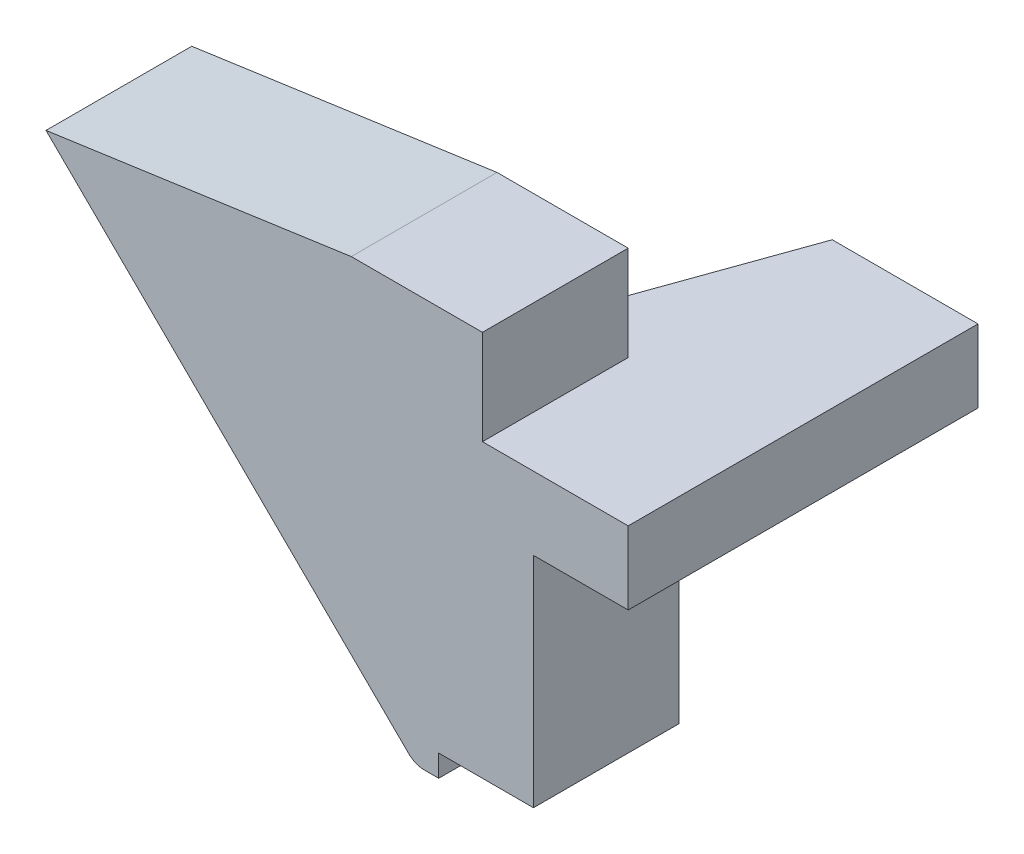
ISO-10303-21;
HEADER;
FILE_DESCRIPTION(('STEP AP214'),'2;1');
FILE_NAME('part.step','',(''),(''),'','','');
FILE_SCHEMA(('AUTOMOTIVE_DESIGN { 1 0 10303 214 1 1 1 1 }'));
ENDSEC;
DATA;
#1=APPLICATION_CONTEXT('core data for automotive mechanical design processes');
#2=APPLICATION_PROTOCOL_DEFINITION('international standard','automotive_design',2000,#1);
#3=PRODUCT_CONTEXT('',#1,'mechanical');
#4=PRODUCT('Part','Part','',(#3));
#5=PRODUCT_RELATED_PRODUCT_CATEGORY('part','',(#4));
#6=PRODUCT_DEFINITION_FORMATION('','',#4);
#7=PRODUCT_DEFINITION_CONTEXT('part definition',#1,'design');
#8=PRODUCT_DEFINITION('design','',#6,#7);
#9=PRODUCT_DEFINITION_SHAPE('','',#8);
#10=(LENGTH_UNIT() NAMED_UNIT(*) SI_UNIT(.MILLI.,.METRE.));
#11=(NAMED_UNIT(*) PLANE_ANGLE_UNIT() SI_UNIT($,.RADIAN.));
#12=(NAMED_UNIT(*) SI_UNIT($,.STERADIAN.) SOLID_ANGLE_UNIT());
#13=UNCERTAINTY_MEASURE_WITH_UNIT(LENGTH_MEASURE(1.E-05),#10,'distance_accuracy_value','');
#14=(GEOMETRIC_REPRESENTATION_CONTEXT(3) GLOBAL_UNCERTAINTY_ASSIGNED_CONTEXT((#13)) GLOBAL_UNIT_ASSIGNED_CONTEXT((#10,
#11,#12)) REPRESENTATION_CONTEXT('',''));
#15=CARTESIAN_POINT('',(0.,0.,0.));
#16=DIRECTION('',(0.,0.,1.));
#17=DIRECTION('',(1.,0.,0.));
#18=AXIS2_PLACEMENT_3D('',#15,#16,#17);
#19=CARTESIAN_POINT('',(-13.,0.,164.159554326699));
#20=DIRECTION('',(0.,0.,1.));
#21=DIRECTION('',(-1.,0.,0.));
#22=AXIS2_PLACEMENT_3D('',#19,#20,#21);
#23=PLANE('',#22);
#24=DIRECTION('',(1.,0.,0.));
#25=VECTOR('',#24,1.);
#26=CARTESIAN_POINT('',(-7.99999999999999,22.,164.159554326699));
#27=LINE('',#26,#25);
#28=CARTESIAN_POINT('',(-7.99999999999999,22.,164.159554326699));
#29=VERTEX_POINT('',#28);
#30=CARTESIAN_POINT('',(2.,22.,164.159554326699));
#31=VERTEX_POINT('',#30);
#32=EDGE_CURVE('E226',#29,#31,#27,.T.);
#33=ORIENTED_EDGE('',*,*,#32,.T.);
#34=DIRECTION('',(0.,-1.,0.));
#35=VECTOR('',#34,1.);
#36=CARTESIAN_POINT('',(2.,30.,164.159554326699));
#37=LINE('',#36,#35);
#38=CARTESIAN_POINT('',(2.,0.,164.159554326699));
#39=VERTEX_POINT('',#38);
#40=EDGE_CURVE('E281',#31,#39,#37,.T.);
#41=ORIENTED_EDGE('',*,*,#40,.T.);
#42=DIRECTION('',(-1.,0.,0.));
#43=VECTOR('',#42,1.);
#44=CARTESIAN_POINT('',(2.,0.,164.159554326699));
#45=LINE('',#44,#43);
#46=CARTESIAN_POINT('',(-11.,0.,164.159554326699));
#47=VERTEX_POINT('',#46);
#48=EDGE_CURVE('E284',#39,#47,#45,.T.);
#49=ORIENTED_EDGE('',*,*,#48,.T.);
#50=DIRECTION('',(0.,-1.,0.));
#51=VECTOR('',#50,1.);
#52=CARTESIAN_POINT('',(-11.,0.,164.159554326699));
#53=LINE('',#52,#51);
#54=CARTESIAN_POINT('',(-11.,-3.,164.159554326699));
#55=VERTEX_POINT('',#54);
#56=EDGE_CURVE('E287',#47,#55,#53,.T.);
#57=ORIENTED_EDGE('',*,*,#56,.T.);
#58=DIRECTION('',(-1.,0.,0.));
#59=VECTOR('',#58,1.);
#60=CARTESIAN_POINT('',(-11.,-3.,164.159554326699));
#61=LINE('',#60,#59);
#62=CARTESIAN_POINT('',(-13.,-3.,164.159554326699));
#63=VERTEX_POINT('',#62);
#64=EDGE_CURVE('E290',#55,#63,#61,.T.);
#65=ORIENTED_EDGE('',*,*,#64,.T.);
#66=CARTESIAN_POINT('',(-13.,0.,164.159554326699));
#67=DIRECTION('',(0.,0.,-1.));
#68=DIRECTION('',(-1.,0.,0.));
#69=AXIS2_PLACEMENT_3D('',#66,#67,#68);
#70=CIRCLE('',#69,3.);
#71=CARTESIAN_POINT('',(-15.1213203435597,-2.12132034355963,164.159554326699));
#72=VERTEX_POINT('',#71);
#73=EDGE_CURVE('E293',#63,#72,#70,.T.);
#74=ORIENTED_EDGE('',*,*,#73,.T.);
#75=DIRECTION('',(-0.711348006313715,0.702839963230252,0.));
#76=VECTOR('',#75,1.);
#77=CARTESIAN_POINT('',(-15.1213203435597,-2.12132034355963,164.159554326699));
#78=LINE('',#77,#76);
#79=CARTESIAN_POINT('',(-64.8885781508878,47.0506986076638,164.159554326699));
#80=VERTEX_POINT('',#79);
#81=EDGE_CURVE('E296',#72,#80,#78,.T.);
#82=ORIENTED_EDGE('',*,*,#81,.T.);
#83=DIRECTION('',(0.99006425657859,0.140615674252494,0.));
#84=VECTOR('',#83,1.);
#85=CARTESIAN_POINT('',(-64.8885781508878,47.0506986076638,164.159554326699));
#86=LINE('',#85,#84);
#87=CARTESIAN_POINT('',(-23.0000000000006,53.,164.159554326699));
#88=VERTEX_POINT('',#87);
#89=EDGE_CURVE('E299',#80,#88,#86,.T.);
#90=ORIENTED_EDGE('',*,*,#89,.T.);
#91=DIRECTION('',(1.,0.,0.));
#92=VECTOR('',#91,1.);
#93=CARTESIAN_POINT('',(-23.0000000000006,53.,164.159554326699));
#94=LINE('',#93,#92);
#95=CARTESIAN_POINT('',(-5.,53.,164.159554326699));
#96=VERTEX_POINT('',#95);
#97=EDGE_CURVE('E302',#88,#96,#94,.T.);
#98=ORIENTED_EDGE('',*,*,#97,.T.);
#99=DIRECTION('',(0.,-1.,0.));
#100=VECTOR('',#99,1.);
#101=CARTESIAN_POINT('',(-5.,53.,164.159554326699));
#102=LINE('',#101,#100);
#103=CARTESIAN_POINT('',(-5.,40.,164.159554326699));
#104=VERTEX_POINT('',#103);
#105=EDGE_CURVE('E217',#96,#104,#102,.T.);
#106=ORIENTED_EDGE('',*,*,#105,.T.);
#107=DIRECTION('',(-1.,0.,0.));
#108=VECTOR('',#107,1.);
#109=CARTESIAN_POINT('',(15.,40.,164.159554326699));
#110=LINE('',#109,#108);
#111=CARTESIAN_POINT('',(-15.,40.,164.159554326699));
#112=VERTEX_POINT('',#111);
#113=EDGE_CURVE('E198',#104,#112,#110,.T.);
#114=ORIENTED_EDGE('',*,*,#113,.T.);
#115=DIRECTION('',(0.,-1.,0.));
#116=VECTOR('',#115,1.);
#117=CARTESIAN_POINT('',(-15.,40.,164.159554326699));
#118=LINE('',#117,#116);
#119=CARTESIAN_POINT('',(-15.,43.,164.159554326699));
#120=VERTEX_POINT('',#119);
#121=EDGE_CURVE('E204',#120,#112,#118,.T.);
#122=ORIENTED_EDGE('',*,*,#121,.F.);
#123=DIRECTION('',(1.,0.,0.));
#124=VECTOR('',#123,1.);
#125=CARTESIAN_POINT('',(-5.,43.,164.159554326699));
#126=LINE('',#125,#124);
#127=CARTESIAN_POINT('',(-22.2934113871567,43.,164.159554326699));
#128=VERTEX_POINT('',#127);
#129=EDGE_CURVE('E261',#128,#120,#126,.T.);
#130=ORIENTED_EDGE('',*,*,#129,.F.);
#131=DIRECTION('',(0.99006425657859,0.140615674252493,0.));
#132=VECTOR('',#131,1.);
#133=CARTESIAN_POINT('',(-21.5938432574751,43.0993574342141,164.159554326699));
#134=LINE('',#133,#132);
#135=CARTESIAN_POINT('',(-43.5109209246919,39.9865446714646,164.159554326699));
#136=VERTEX_POINT('',#135);
#137=EDGE_CURVE('E264',#136,#128,#134,.T.);
#138=ORIENTED_EDGE('',*,*,#137,.F.);
#139=DIRECTION('',(-0.711348006313715,0.702839963230252,0.));
#140=VECTOR('',#139,1.);
#141=CARTESIAN_POINT('',(-8.09292071125713,4.99215971957752,164.159554326699));
#142=LINE('',#141,#140);
#143=CARTESIAN_POINT('',(-13.1613820762649,10.,164.159554326699));
#144=VERTEX_POINT('',#143);
#145=EDGE_CURVE('E267',#144,#136,#142,.T.);
#146=ORIENTED_EDGE('',*,*,#145,.F.);
#147=DIRECTION('',(-1.,0.,0.));
#148=VECTOR('',#147,1.);
#149=CARTESIAN_POINT('',(0.,10.,164.159554326699));
#150=LINE('',#149,#148);
#151=CARTESIAN_POINT('',(-8.,10.,164.159554326699));
#152=VERTEX_POINT('',#151);
#153=EDGE_CURVE('E270',#152,#144,#150,.T.);
#154=ORIENTED_EDGE('',*,*,#153,.F.);
#155=DIRECTION('',(0.,-1.,0.));
#156=VECTOR('',#155,1.);
#157=CARTESIAN_POINT('',(-8.,0.,164.159554326699));
#158=LINE('',#157,#156);
#159=EDGE_CURVE('E211',#29,#152,#158,.T.);
#160=ORIENTED_EDGE('',*,*,#159,.F.);
#161=EDGE_LOOP('',(#33,#41,#49,#57,#65,#74,#82,#90,#98,#106,#114,#122,#130,#138,#146,#154,#160));
#162=FACE_BOUND('',#161,.T.);
#163=ADVANCED_FACE('F33',(#162),#23,.F.);
#164=CARTESIAN_POINT('',(15.,0.,252.319108653397));
#165=DIRECTION('',(1.,0.,0.));
#166=DIRECTION('',(0.,0.,1.));
#167=AXIS2_PLACEMENT_3D('',#164,#165,#166);
#168=PLANE('',#167);
#169=DIRECTION('',(0.,0.,-1.));
#170=VECTOR('',#169,1.);
#171=CARTESIAN_POINT('',(15.,40.,231.319108653397));
#172=LINE('',#171,#170);
#173=CARTESIAN_POINT('',(15.,40.,184.159554326699));
#174=VERTEX_POINT('',#173);
#175=CARTESIAN_POINT('',(15.,40.,136.159554326699));
#176=VERTEX_POINT('',#175);
#177=EDGE_CURVE('E342',#174,#176,#172,.T.);
#178=ORIENTED_EDGE('',*,*,#177,.F.);
#179=DIRECTION('',(0.,1.,0.));
#180=VECTOR('',#179,1.);
#181=CARTESIAN_POINT('',(15.,0.,184.159554326699));
#182=LINE('',#181,#180);
#183=CARTESIAN_POINT('',(15.,30.,184.159554326699));
#184=VERTEX_POINT('',#183);
#185=EDGE_CURVE('E319',#184,#174,#182,.T.);
#186=ORIENTED_EDGE('',*,*,#185,.F.);
#187=DIRECTION('',(0.,0.,1.));
#188=VECTOR('',#187,1.);
#189=CARTESIAN_POINT('',(15.,30.,169.159554326699));
#190=LINE('',#189,#188);
#191=CARTESIAN_POINT('',(15.,30.,136.159554326699));
#192=VERTEX_POINT('',#191);
#193=EDGE_CURVE('E306',#192,#184,#190,.T.);
#194=ORIENTED_EDGE('',*,*,#193,.F.);
#195=DIRECTION('',(0.,1.,0.));
#196=VECTOR('',#195,1.);
#197=CARTESIAN_POINT('',(15.,30.,136.159554326699));
#198=LINE('',#197,#196);
#199=EDGE_CURVE('E228',#192,#176,#198,.T.);
#200=ORIENTED_EDGE('',*,*,#199,.T.);
#201=EDGE_LOOP('',(#178,#186,#194,#200));
#202=FACE_BOUND('',#201,.T.);
#203=ADVANCED_FACE('F374',(#202),#168,.T.);
#204=CARTESIAN_POINT('',(-11.,0.,80.3191086533971));
#205=DIRECTION('',(-1.,0.,0.));
#206=DIRECTION('',(0.,-1.,0.));
#207=AXIS2_PLACEMENT_3D('',#204,#205,#206);
#208=PLANE('',#207);
#209=DIRECTION('',(0.,-1.,0.));
#210=VECTOR('',#209,1.);
#211=CARTESIAN_POINT('',(-11.,0.,184.159554326699));
#212=LINE('',#211,#210);
#213=CARTESIAN_POINT('',(-11.,0.,184.159554326699));
#214=VERTEX_POINT('',#213);
#215=CARTESIAN_POINT('',(-11.,-3.,184.159554326699));
#216=VERTEX_POINT('',#215);
#217=EDGE_CURVE('E327',#214,#216,#212,.T.);
#218=ORIENTED_EDGE('',*,*,#217,.T.);
#219=DIRECTION('',(0.,0.,1.));
#220=VECTOR('',#219,1.);
#221=CARTESIAN_POINT('',(-11.,-3.,80.3191086533971));
#222=LINE('',#221,#220);
#223=EDGE_CURVE('E344',#55,#216,#222,.T.);
#224=ORIENTED_EDGE('',*,*,#223,.F.);
#225=ORIENTED_EDGE('',*,*,#56,.F.);
#226=DIRECTION('',(0.,0.,1.));
#227=VECTOR('',#226,1.);
#228=CARTESIAN_POINT('',(-11.,0.,80.3191086533971));
#229=LINE('',#228,#227);
#230=EDGE_CURVE('E345',#47,#214,#229,.T.);
#231=ORIENTED_EDGE('',*,*,#230,.T.);
#232=EDGE_LOOP('',(#218,#224,#225,#231));
#233=FACE_BOUND('',#232,.T.);
#234=ADVANCED_FACE('F431',(#233),#208,.F.);
#235=CARTESIAN_POINT('',(-5.,-3.,80.3191086533971));
#236=DIRECTION('',(0.,1.,0.));
#237=DIRECTION('',(-1.,0.,0.));
#238=AXIS2_PLACEMENT_3D('',#235,#236,#237);
#239=PLANE('',#238);
#240=DIRECTION('',(1.,0.,0.));
#241=VECTOR('',#240,1.);
#242=CARTESIAN_POINT('',(-82.5,-3.,184.159554326699));
#243=LINE('',#242,#241);
#244=CARTESIAN_POINT('',(-13.,-3.,184.159554326699));
#245=VERTEX_POINT('',#244);
#246=EDGE_CURVE('E315',#245,#216,#243,.T.);
#247=ORIENTED_EDGE('',*,*,#246,.F.);
#248=DIRECTION('',(0.,0.,1.));
#249=VECTOR('',#248,1.);
#250=CARTESIAN_POINT('',(-13.,-3.,80.3191086533971));
#251=LINE('',#250,#249);
#252=EDGE_CURVE('E348',#63,#245,#251,.T.);
#253=ORIENTED_EDGE('',*,*,#252,.F.);
#254=ORIENTED_EDGE('',*,*,#64,.F.);
#255=ORIENTED_EDGE('',*,*,#223,.T.);
#256=EDGE_LOOP('',(#247,#253,#254,#255));
#257=FACE_BOUND('',#256,.T.);
#258=ADVANCED_FACE('F442',(#257),#239,.F.);
#259=CARTESIAN_POINT('',(-13.,0.,80.3191086533971));
#260=DIRECTION('',(0.,0.,1.));
#261=DIRECTION('',(-1.,0.,0.));
#262=AXIS2_PLACEMENT_3D('',#259,#260,#261);
#263=CYLINDRICAL_SURFACE('',#262,3.);
#264=CARTESIAN_POINT('',(-13.,0.,184.159554326699));
#265=DIRECTION('',(0.,0.,-1.));
#266=DIRECTION('',(-1.,0.,0.));
#267=AXIS2_PLACEMENT_3D('',#264,#265,#266);
#268=CIRCLE('',#267,3.);
#269=CARTESIAN_POINT('',(-15.1213203435597,-2.12132034355963,184.159554326699));
#270=VERTEX_POINT('',#269);
#271=EDGE_CURVE('E333',#245,#270,#268,.T.);
#272=ORIENTED_EDGE('',*,*,#271,.T.);
#273=DIRECTION('',(0.,0.,1.));
#274=VECTOR('',#273,1.);
#275=CARTESIAN_POINT('',(-15.1213203435597,-2.12132034355963,80.3191086533971));
#276=LINE('',#275,#274);
#277=EDGE_CURVE('E353',#72,#270,#276,.T.);
#278=ORIENTED_EDGE('',*,*,#277,.F.);
#279=ORIENTED_EDGE('',*,*,#73,.F.);
#280=ORIENTED_EDGE('',*,*,#252,.T.);
#281=EDGE_LOOP('',(#272,#278,#279,#280));
#282=FACE_BOUND('',#281,.T.);
#283=ADVANCED_FACE('F446',(#282),#263,.T.);
#284=CARTESIAN_POINT('',(-15.1213203435597,-2.12132034355963,80.3191086533971));
#285=DIRECTION('',(0.702839963230252,0.711348006313715,0.));
#286=DIRECTION('',(-0.711348006313715,0.702839963230252,0.));
#287=AXIS2_PLACEMENT_3D('',#284,#285,#286);
#288=PLANE('',#287);
#289=DIRECTION('',(-0.711348006313715,0.702839963230252,0.));
#290=VECTOR('',#289,1.);
#291=CARTESIAN_POINT('',(-15.1213203435597,-2.12132034355963,184.159554326699));
#292=LINE('',#291,#290);
#293=CARTESIAN_POINT('',(-64.8885781508878,47.0506986076638,184.159554326699));
#294=VERTEX_POINT('',#293);
#295=EDGE_CURVE('E336',#270,#294,#292,.T.);
#296=ORIENTED_EDGE('',*,*,#295,.T.);
#297=DIRECTION('',(0.,0.,1.));
#298=VECTOR('',#297,1.);
#299=CARTESIAN_POINT('',(-64.8885781508878,47.0506986076638,80.3191086533971));
#300=LINE('',#299,#298);
#301=EDGE_CURVE('E356',#80,#294,#300,.T.);
#302=ORIENTED_EDGE('',*,*,#301,.F.);
#303=ORIENTED_EDGE('',*,*,#81,.F.);
#304=ORIENTED_EDGE('',*,*,#277,.T.);
#305=EDGE_LOOP('',(#296,#302,#303,#304));
#306=FACE_BOUND('',#305,.T.);
#307=ADVANCED_FACE('F450',(#306),#288,.F.);
#308=CARTESIAN_POINT('',(-23.,53.,80.3191086533971));
#309=DIRECTION('',(0.140615674252493,-0.99006425657859,0.));
#310=DIRECTION('',(0.99006425657859,0.140615674252493,0.));
#311=AXIS2_PLACEMENT_3D('',#308,#309,#310);
#312=PLANE('',#311);
#313=DIRECTION('',(0.99006425657859,0.140615674252493,0.));
#314=VECTOR('',#313,1.);
#315=CARTESIAN_POINT('',(-23.,53.,184.159554326699));
#316=LINE('',#315,#314);
#317=CARTESIAN_POINT('',(-23.0000000000006,53.,184.159554326699));
#318=VERTEX_POINT('',#317);
#319=EDGE_CURVE('E339',#294,#318,#316,.T.);
#320=ORIENTED_EDGE('',*,*,#319,.T.);
#321=DIRECTION('',(0.,0.,1.));
#322=VECTOR('',#321,1.);
#323=CARTESIAN_POINT('',(-23.,53.,80.3191086533971));
#324=LINE('',#323,#322);
#325=EDGE_CURVE('E359',#88,#318,#324,.T.);
#326=ORIENTED_EDGE('',*,*,#325,.F.);
#327=ORIENTED_EDGE('',*,*,#89,.F.);
#328=ORIENTED_EDGE('',*,*,#301,.T.);
#329=EDGE_LOOP('',(#320,#326,#327,#328));
#330=FACE_BOUND('',#329,.T.);
#331=ADVANCED_FACE('F454',(#330),#312,.F.);
#332=CARTESIAN_POINT('',(-5.,53.,80.3191086533971));
#333=DIRECTION('',(0.,-1.,0.));
#334=DIRECTION('',(0.,0.,1.));
#335=AXIS2_PLACEMENT_3D('',#332,#333,#334);
#336=PLANE('',#335);
#337=DIRECTION('',(1.,0.,0.));
#338=VECTOR('',#337,1.);
#339=CARTESIAN_POINT('',(-82.5,53.,184.159554326699));
#340=LINE('',#339,#338);
#341=CARTESIAN_POINT('',(-5.,53.,184.159554326699));
#342=VERTEX_POINT('',#341);
#343=EDGE_CURVE('E316',#318,#342,#340,.T.);
#344=ORIENTED_EDGE('',*,*,#343,.T.);
#345=DIRECTION('',(0.,0.,1.));
#346=VECTOR('',#345,1.);
#347=CARTESIAN_POINT('',(-5.,53.,80.3191086533971));
#348=LINE('',#347,#346);
#349=EDGE_CURVE('E221',#96,#342,#348,.T.);
#350=ORIENTED_EDGE('',*,*,#349,.F.);
#351=ORIENTED_EDGE('',*,*,#97,.F.);
#352=ORIENTED_EDGE('',*,*,#325,.T.);
#353=EDGE_LOOP('',(#344,#350,#351,#352));
#354=FACE_BOUND('',#353,.T.);
#355=ADVANCED_FACE('F367',(#354),#336,.F.);
#356=CARTESIAN_POINT('',(-5.,40.,80.3191086533971));
#357=DIRECTION('',(-1.,0.,0.));
#358=DIRECTION('',(0.,0.,-1.));
#359=AXIS2_PLACEMENT_3D('',#356,#357,#358);
#360=PLANE('',#359);
#361=DIRECTION('',(0.,-1.,0.));
#362=VECTOR('',#361,1.);
#363=CARTESIAN_POINT('',(-5.,40.,184.159554326699));
#364=LINE('',#363,#362);
#365=CARTESIAN_POINT('',(-5.,40.,184.159554326699));
#366=VERTEX_POINT('',#365);
#367=EDGE_CURVE('E330',#342,#366,#364,.T.);
#368=ORIENTED_EDGE('',*,*,#367,.T.);
#369=DIRECTION('',(0.,0.,1.));
#370=VECTOR('',#369,1.);
#371=CARTESIAN_POINT('',(-5.,40.,80.3191086533971));
#372=LINE('',#371,#370);
#373=EDGE_CURVE('E218',#104,#366,#372,.T.);
#374=ORIENTED_EDGE('',*,*,#373,.F.);
#375=ORIENTED_EDGE('',*,*,#105,.F.);
#376=ORIENTED_EDGE('',*,*,#349,.T.);
#377=EDGE_LOOP('',(#368,#374,#375,#376));
#378=FACE_BOUND('',#377,.T.);
#379=ADVANCED_FACE('F364',(#378),#360,.F.);
#380=CARTESIAN_POINT('',(0.,40.,80.3191086533971));
#381=DIRECTION('',(0.,-1.,0.));
#382=DIRECTION('',(0.,0.,1.));
#383=AXIS2_PLACEMENT_3D('',#380,#381,#382);
#384=PLANE('',#383);
#385=ORIENTED_EDGE('',*,*,#113,.F.);
#386=ORIENTED_EDGE('',*,*,#373,.T.);
#387=DIRECTION('',(1.,0.,0.));
#388=VECTOR('',#387,1.);
#389=CARTESIAN_POINT('',(0.,40.,184.159554326699));
#390=LINE('',#389,#388);
#391=EDGE_CURVE('E323',#366,#174,#390,.T.);
#392=ORIENTED_EDGE('',*,*,#391,.T.);
#393=ORIENTED_EDGE('',*,*,#177,.T.);
#394=DIRECTION('',(-1.,0.,0.));
#395=VECTOR('',#394,1.);
#396=CARTESIAN_POINT('',(15.,40.,136.159554326699));
#397=LINE('',#396,#395);
#398=CARTESIAN_POINT('',(-5.,40.,136.159554326699));
#399=VERTEX_POINT('',#398);
#400=EDGE_CURVE('E201',#176,#399,#397,.T.);
#401=ORIENTED_EDGE('',*,*,#400,.T.);
#402=DIRECTION('',(-0.336336396998156,0.,0.941741911594837));
#403=VECTOR('',#402,1.);
#404=CARTESIAN_POINT('',(-5.,40.,136.159554326699));
#405=LINE('',#404,#403);
#406=EDGE_CURVE('E183',#399,#112,#405,.T.);
#407=ORIENTED_EDGE('',*,*,#406,.T.);
#408=EDGE_LOOP('',(#385,#386,#392,#393,#401,#407));
#409=FACE_BOUND('',#408,.T.);
#410=ADVANCED_FACE('F195',(#409),#384,.F.);
#411=CARTESIAN_POINT('',(0.,0.,80.3191086533971));
#412=DIRECTION('',(0.,1.,0.));
#413=DIRECTION('',(-1.,0.,0.));
#414=AXIS2_PLACEMENT_3D('',#411,#412,#413);
#415=PLANE('',#414);
#416=DIRECTION('',(-1.,0.,0.));
#417=VECTOR('',#416,1.);
#418=CARTESIAN_POINT('',(0.,0.,184.159554326699));
#419=LINE('',#418,#417);
#420=CARTESIAN_POINT('',(2.,0.,184.159554326699));
#421=VERTEX_POINT('',#420);
#422=EDGE_CURVE('E325',#421,#214,#419,.T.);
#423=ORIENTED_EDGE('',*,*,#422,.T.);
#424=ORIENTED_EDGE('',*,*,#230,.F.);
#425=ORIENTED_EDGE('',*,*,#48,.F.);
#426=DIRECTION('',(0.,0.,1.));
#427=VECTOR('',#426,1.);
#428=CARTESIAN_POINT('',(2.,0.,169.159554326699));
#429=LINE('',#428,#427);
#430=EDGE_CURVE('E312',#39,#421,#429,.T.);
#431=ORIENTED_EDGE('',*,*,#430,.T.);
#432=EDGE_LOOP('',(#423,#424,#425,#431));
#433=FACE_BOUND('',#432,.T.);
#434=ADVANCED_FACE('F35',(#433),#415,.F.);
#435=CARTESIAN_POINT('',(-82.5,-3.,184.159554326699));
#436=DIRECTION('',(0.,0.,1.));
#437=DIRECTION('',(-1.,0.,0.));
#438=AXIS2_PLACEMENT_3D('',#435,#436,#437);
#439=PLANE('',#438);
#440=ORIENTED_EDGE('',*,*,#185,.T.);
#441=ORIENTED_EDGE('',*,*,#391,.F.);
#442=ORIENTED_EDGE('',*,*,#367,.F.);
#443=ORIENTED_EDGE('',*,*,#343,.F.);
#444=ORIENTED_EDGE('',*,*,#319,.F.);
#445=ORIENTED_EDGE('',*,*,#295,.F.);
#446=ORIENTED_EDGE('',*,*,#271,.F.);
#447=ORIENTED_EDGE('',*,*,#246,.T.);
#448=ORIENTED_EDGE('',*,*,#217,.F.);
#449=ORIENTED_EDGE('',*,*,#422,.F.);
#450=DIRECTION('',(0.,-1.,0.));
#451=VECTOR('',#450,1.);
#452=CARTESIAN_POINT('',(2.,0.,184.159554326699));
#453=LINE('',#452,#451);
#454=CARTESIAN_POINT('',(2.,30.,184.159554326699));
#455=VERTEX_POINT('',#454);
#456=EDGE_CURVE('E308',#455,#421,#453,.T.);
#457=ORIENTED_EDGE('',*,*,#456,.F.);
#458=DIRECTION('',(-1.,0.,0.));
#459=VECTOR('',#458,1.);
#460=CARTESIAN_POINT('',(15.,30.,184.159554326699));
#461=LINE('',#460,#459);
#462=EDGE_CURVE('E304',#184,#455,#461,.T.);
#463=ORIENTED_EDGE('',*,*,#462,.F.);
#464=EDGE_LOOP('',(#440,#441,#442,#443,#444,#445,#446,#447,#448,#449,#457,#463));
#465=FACE_BOUND('',#464,.T.);
#466=ADVANCED_FACE('F369',(#465),#439,.T.);
#467=CARTESIAN_POINT('',(2.,0.,169.159554326699));
#468=DIRECTION('',(1.,0.,0.));
#469=DIRECTION('',(0.,0.,1.));
#470=AXIS2_PLACEMENT_3D('',#467,#468,#469);
#471=PLANE('',#470);
#472=DIRECTION('',(0.,0.274721127897378,-0.961523947640823));
#473=VECTOR('',#472,1.);
#474=CARTESIAN_POINT('',(2.,30.,136.159554326699));
#475=LINE('',#474,#473);
#476=CARTESIAN_POINT('',(2.,30.,136.159554326699));
#477=VERTEX_POINT('',#476);
#478=EDGE_CURVE('E383',#31,#477,#475,.T.);
#479=ORIENTED_EDGE('',*,*,#478,.T.);
#480=DIRECTION('',(0.,0.,1.));
#481=VECTOR('',#480,1.);
#482=CARTESIAN_POINT('',(2.,30.,169.159554326699));
#483=LINE('',#482,#481);
#484=EDGE_CURVE('E54',#477,#455,#483,.T.);
#485=ORIENTED_EDGE('',*,*,#484,.T.);
#486=ORIENTED_EDGE('',*,*,#456,.T.);
#487=ORIENTED_EDGE('',*,*,#430,.F.);
#488=ORIENTED_EDGE('',*,*,#40,.F.);
#489=EDGE_LOOP('',(#479,#485,#486,#487,#488));
#490=FACE_BOUND('',#489,.T.);
#491=ADVANCED_FACE('F422',(#490),#471,.T.);
#492=CARTESIAN_POINT('',(15.,30.,169.159554326699));
#493=DIRECTION('',(0.,-1.,0.));
#494=DIRECTION('',(0.,0.,1.));
#495=AXIS2_PLACEMENT_3D('',#492,#493,#494);
#496=PLANE('',#495);
#497=ORIENTED_EDGE('',*,*,#462,.T.);
#498=ORIENTED_EDGE('',*,*,#484,.F.);
#499=DIRECTION('',(1.,0.,0.));
#500=VECTOR('',#499,1.);
#501=CARTESIAN_POINT('',(2.,30.,136.159554326699));
#502=LINE('',#501,#500);
#503=EDGE_CURVE('E212',#477,#192,#502,.T.);
#504=ORIENTED_EDGE('',*,*,#503,.T.);
#505=ORIENTED_EDGE('',*,*,#193,.T.);
#506=EDGE_LOOP('',(#497,#498,#504,#505));
#507=FACE_BOUND('',#506,.T.);
#508=ADVANCED_FACE('F415',(#507),#496,.T.);
#509=CARTESIAN_POINT('',(-8.09292071125713,4.99215971957752,80.3191086533971));
#510=DIRECTION('',(0.702839963230252,0.711348006313715,0.));
#511=DIRECTION('',(-0.711348006313715,0.702839963230252,0.));
#512=AXIS2_PLACEMENT_3D('',#509,#510,#511);
#513=PLANE('',#512);
#514=DIRECTION('',(0.,0.,1.));
#515=VECTOR('',#514,1.);
#516=CARTESIAN_POINT('',(-13.1613820762649,10.,80.3191086533971));
#517=LINE('',#516,#515);
#518=CARTESIAN_POINT('',(-13.1613820762649,10.,174.159554326699));
#519=VERTEX_POINT('',#518);
#520=EDGE_CURVE('E237',#144,#519,#517,.T.);
#521=ORIENTED_EDGE('',*,*,#520,.F.);
#522=ORIENTED_EDGE('',*,*,#145,.T.);
#523=DIRECTION('',(0.,0.,1.));
#524=VECTOR('',#523,1.);
#525=CARTESIAN_POINT('',(-43.5109209246919,39.9865446714646,80.3191086533971));
#526=LINE('',#525,#524);
#527=CARTESIAN_POINT('',(-43.5109209246919,39.9865446714646,174.159554326699));
#528=VERTEX_POINT('',#527);
#529=EDGE_CURVE('E249',#136,#528,#526,.T.);
#530=ORIENTED_EDGE('',*,*,#529,.T.);
#531=DIRECTION('',(-0.711348006313715,0.702839963230252,0.));
#532=VECTOR('',#531,1.);
#533=CARTESIAN_POINT('',(-8.09292071125713,4.99215971957752,174.159554326699));
#534=LINE('',#533,#532);
#535=EDGE_CURVE('E241',#519,#528,#534,.T.);
#536=ORIENTED_EDGE('',*,*,#535,.F.);
#537=EDGE_LOOP('',(#521,#522,#530,#536));
#538=FACE_BOUND('',#537,.T.);
#539=ADVANCED_FACE('F413',(#538),#513,.T.);
#540=CARTESIAN_POINT('',(-21.5938432574751,43.0993574342141,80.3191086533971));
#541=DIRECTION('',(0.140615674252493,-0.99006425657859,0.));
#542=DIRECTION('',(0.99006425657859,0.140615674252493,0.));
#543=AXIS2_PLACEMENT_3D('',#540,#541,#542);
#544=PLANE('',#543);
#545=DIRECTION('',(0.99006425657859,0.140615674252493,0.));
#546=VECTOR('',#545,1.);
#547=CARTESIAN_POINT('',(-21.5938432574751,43.0993574342141,174.159554326699));
#548=LINE('',#547,#546);
#549=CARTESIAN_POINT('',(-22.2934113871567,43.,174.159554326699));
#550=VERTEX_POINT('',#549);
#551=EDGE_CURVE('E250',#528,#550,#548,.T.);
#552=ORIENTED_EDGE('',*,*,#551,.F.);
#553=ORIENTED_EDGE('',*,*,#529,.F.);
#554=ORIENTED_EDGE('',*,*,#137,.T.);
#555=DIRECTION('',(0.,0.,1.));
#556=VECTOR('',#555,1.);
#557=CARTESIAN_POINT('',(-22.2934113871567,43.,80.3191086533971));
#558=LINE('',#557,#556);
#559=EDGE_CURVE('E243',#128,#550,#558,.T.);
#560=ORIENTED_EDGE('',*,*,#559,.T.);
#561=EDGE_LOOP('',(#552,#553,#554,#560));
#562=FACE_BOUND('',#561,.T.);
#563=ADVANCED_FACE('F411',(#562),#544,.T.);
#564=CARTESIAN_POINT('',(-5.,43.,80.3191086533971));
#565=DIRECTION('',(0.,-1.,0.));
#566=DIRECTION('',(0.,0.,1.));
#567=AXIS2_PLACEMENT_3D('',#564,#565,#566);
#568=PLANE('',#567);
#569=DIRECTION('',(1.,0.,0.));
#570=VECTOR('',#569,1.);
#571=CARTESIAN_POINT('',(-5.,43.,174.159554326699));
#572=LINE('',#571,#570);
#573=CARTESIAN_POINT('',(-15.,43.,174.159554326699));
#574=VERTEX_POINT('',#573);
#575=EDGE_CURVE('E234',#550,#574,#572,.T.);
#576=ORIENTED_EDGE('',*,*,#575,.F.);
#577=ORIENTED_EDGE('',*,*,#559,.F.);
#578=ORIENTED_EDGE('',*,*,#129,.T.);
#579=DIRECTION('',(0.,0.,1.));
#580=VECTOR('',#579,1.);
#581=CARTESIAN_POINT('',(-15.,43.,80.3191086533971));
#582=LINE('',#581,#580);
#583=EDGE_CURVE('E207',#120,#574,#582,.T.);
#584=ORIENTED_EDGE('',*,*,#583,.T.);
#585=EDGE_LOOP('',(#576,#577,#578,#584));
#586=FACE_BOUND('',#585,.T.);
#587=ADVANCED_FACE('F408',(#586),#568,.T.);
#588=CARTESIAN_POINT('',(-15.,40.,80.3191086533971));
#589=DIRECTION('',(-1.,0.,0.));
#590=DIRECTION('',(0.,0.,-1.));
#591=AXIS2_PLACEMENT_3D('',#588,#589,#590);
#592=PLANE('',#591);
#593=DIRECTION('',(0.,1.,0.));
#594=VECTOR('',#593,1.);
#595=CARTESIAN_POINT('',(-15.,20.,164.159554326699));
#596=LINE('',#595,#594);
#597=CARTESIAN_POINT('',(-15.,30.,164.159554326699));
#598=VERTEX_POINT('',#597);
#599=EDGE_CURVE('E180',#598,#112,#596,.T.);
#600=ORIENTED_EDGE('',*,*,#599,.F.);
#601=DIRECTION('',(0.,0.,1.));
#602=VECTOR('',#601,1.);
#603=CARTESIAN_POINT('',(-15.,30.,80.3191086533971));
#604=LINE('',#603,#602);
#605=CARTESIAN_POINT('',(-15.,30.,174.159554326699));
#606=VERTEX_POINT('',#605);
#607=EDGE_CURVE('E235',#598,#606,#604,.T.);
#608=ORIENTED_EDGE('',*,*,#607,.T.);
#609=DIRECTION('',(0.,-1.,0.));
#610=VECTOR('',#609,1.);
#611=CARTESIAN_POINT('',(-15.,40.,174.159554326699));
#612=LINE('',#611,#610);
#613=EDGE_CURVE('E238',#574,#606,#612,.T.);
#614=ORIENTED_EDGE('',*,*,#613,.F.);
#615=ORIENTED_EDGE('',*,*,#583,.F.);
#616=ORIENTED_EDGE('',*,*,#121,.T.);
#617=EDGE_LOOP('',(#600,#608,#614,#615,#616));
#618=FACE_BOUND('',#617,.T.);
#619=ADVANCED_FACE('F205',(#618),#592,.T.);
#620=CARTESIAN_POINT('',(0.,30.,80.3191086533971));
#621=DIRECTION('',(0.,-1.,0.));
#622=DIRECTION('',(0.,0.,1.));
#623=AXIS2_PLACEMENT_3D('',#620,#621,#622);
#624=PLANE('',#623);
#625=DIRECTION('',(0.336336396998156,0.,-0.941741911594837));
#626=VECTOR('',#625,1.);
#627=CARTESIAN_POINT('',(13.252629851272,30.,85.0521907431371));
#628=LINE('',#627,#626);
#629=CARTESIAN_POINT('',(-8.,30.,144.559554326699));
#630=VERTEX_POINT('',#629);
#631=EDGE_CURVE('E186',#598,#630,#628,.T.);
#632=ORIENTED_EDGE('',*,*,#631,.T.);
#633=DIRECTION('',(0.,0.,-1.));
#634=VECTOR('',#633,1.);
#635=CARTESIAN_POINT('',(-8.,30.,80.3191086533971));
#636=LINE('',#635,#634);
#637=CARTESIAN_POINT('',(-8.,30.,174.159554326699));
#638=VERTEX_POINT('',#637);
#639=EDGE_CURVE('E277',#638,#630,#636,.T.);
#640=ORIENTED_EDGE('',*,*,#639,.F.);
#641=DIRECTION('',(1.,0.,0.));
#642=VECTOR('',#641,1.);
#643=CARTESIAN_POINT('',(0.,30.,174.159554326699));
#644=LINE('',#643,#642);
#645=EDGE_CURVE('E230',#606,#638,#644,.T.);
#646=ORIENTED_EDGE('',*,*,#645,.F.);
#647=ORIENTED_EDGE('',*,*,#607,.F.);
#648=EDGE_LOOP('',(#632,#640,#646,#647));
#649=FACE_BOUND('',#648,.T.);
#650=ADVANCED_FACE('F406',(#649),#624,.T.);
#651=CARTESIAN_POINT('',(0.,10.,80.3191086533971));
#652=DIRECTION('',(0.,1.,0.));
#653=DIRECTION('',(-1.,0.,0.));
#654=AXIS2_PLACEMENT_3D('',#651,#652,#653);
#655=PLANE('',#654);
#656=ORIENTED_EDGE('',*,*,#153,.T.);
#657=ORIENTED_EDGE('',*,*,#520,.T.);
#658=DIRECTION('',(-1.,0.,0.));
#659=VECTOR('',#658,1.);
#660=CARTESIAN_POINT('',(0.,10.,174.159554326699));
#661=LINE('',#660,#659);
#662=CARTESIAN_POINT('',(-8.,10.,174.159554326699));
#663=VERTEX_POINT('',#662);
#664=EDGE_CURVE('E233',#663,#519,#661,.T.);
#665=ORIENTED_EDGE('',*,*,#664,.F.);
#666=DIRECTION('',(0.,0.,1.));
#667=VECTOR('',#666,1.);
#668=CARTESIAN_POINT('',(-8.,10.,80.3191086533971));
#669=LINE('',#668,#667);
#670=EDGE_CURVE('E246',#152,#663,#669,.T.);
#671=ORIENTED_EDGE('',*,*,#670,.F.);
#672=EDGE_LOOP('',(#656,#657,#665,#671));
#673=FACE_BOUND('',#672,.T.);
#674=ADVANCED_FACE('F400',(#673),#655,.T.);
#675=CARTESIAN_POINT('',(-82.5,-3.,174.159554326699));
#676=DIRECTION('',(0.,0.,1.));
#677=DIRECTION('',(-1.,0.,0.));
#678=AXIS2_PLACEMENT_3D('',#675,#676,#677);
#679=PLANE('',#678);
#680=ORIENTED_EDGE('',*,*,#645,.T.);
#681=DIRECTION('',(0.,-1.,0.));
#682=VECTOR('',#681,1.);
#683=CARTESIAN_POINT('',(-7.99999999999999,-3.,174.159554326699));
#684=LINE('',#683,#682);
#685=EDGE_CURVE('E260',#638,#663,#684,.T.);
#686=ORIENTED_EDGE('',*,*,#685,.T.);
#687=ORIENTED_EDGE('',*,*,#664,.T.);
#688=ORIENTED_EDGE('',*,*,#535,.T.);
#689=ORIENTED_EDGE('',*,*,#551,.T.);
#690=ORIENTED_EDGE('',*,*,#575,.T.);
#691=ORIENTED_EDGE('',*,*,#613,.T.);
#692=EDGE_LOOP('',(#680,#686,#687,#688,#689,#690,#691));
#693=FACE_BOUND('',#692,.T.);
#694=ADVANCED_FACE('F404',(#693),#679,.F.);
#695=CARTESIAN_POINT('',(-8.,0.,169.159554326699));
#696=DIRECTION('',(1.,0.,0.));
#697=DIRECTION('',(0.,0.,1.));
#698=AXIS2_PLACEMENT_3D('',#695,#696,#697);
#699=PLANE('',#698);
#700=DIRECTION('',(0.,0.274721127897378,-0.961523947640823));
#701=VECTOR('',#700,1.);
#702=CARTESIAN_POINT('',(-8.,19.0188679245283,174.593516590849));
#703=LINE('',#702,#701);
#704=CARTESIAN_POINT('',(-8.00000000000002,27.6,144.559554326699));
#705=VERTEX_POINT('',#704);
#706=EDGE_CURVE('E229',#29,#705,#703,.T.);
#707=ORIENTED_EDGE('',*,*,#706,.F.);
#708=ORIENTED_EDGE('',*,*,#159,.T.);
#709=ORIENTED_EDGE('',*,*,#670,.T.);
#710=ORIENTED_EDGE('',*,*,#685,.F.);
#711=ORIENTED_EDGE('',*,*,#639,.T.);
#712=DIRECTION('',(0.,1.,0.));
#713=VECTOR('',#712,1.);
#714=CARTESIAN_POINT('',(-8.,0.,144.559554326699));
#715=LINE('',#714,#713);
#716=EDGE_CURVE('E386',#705,#630,#715,.T.);
#717=ORIENTED_EDGE('',*,*,#716,.F.);
#718=EDGE_LOOP('',(#707,#708,#709,#710,#711,#717));
#719=FACE_BOUND('',#718,.T.);
#720=ADVANCED_FACE('F395',(#719),#699,.F.);
#721=CARTESIAN_POINT('',(0.,0.,136.159554326699));
#722=DIRECTION('',(0.,0.,-1.));
#723=DIRECTION('',(1.,0.,0.));
#724=AXIS2_PLACEMENT_3D('',#721,#722,#723);
#725=PLANE('',#724);
#726=DIRECTION('',(0.,1.,0.));
#727=VECTOR('',#726,1.);
#728=CARTESIAN_POINT('',(-5.,20.,136.159554326699));
#729=LINE('',#728,#727);
#730=CARTESIAN_POINT('',(-5.,30.,136.159554326699));
#731=VERTEX_POINT('',#730);
#732=EDGE_CURVE('E191',#731,#399,#729,.T.);
#733=ORIENTED_EDGE('',*,*,#732,.T.);
#734=ORIENTED_EDGE('',*,*,#400,.F.);
#735=ORIENTED_EDGE('',*,*,#199,.F.);
#736=ORIENTED_EDGE('',*,*,#503,.F.);
#737=DIRECTION('',(-1.,0.,0.));
#738=VECTOR('',#737,1.);
#739=CARTESIAN_POINT('',(0.,30.,136.159554326699));
#740=LINE('',#739,#738);
#741=EDGE_CURVE('E41',#477,#731,#740,.T.);
#742=ORIENTED_EDGE('',*,*,#741,.T.);
#743=EDGE_LOOP('',(#733,#734,#735,#736,#742));
#744=FACE_BOUND('',#743,.T.);
#745=ADVANCED_FACE('F388',(#744),#725,.T.);
#746=CARTESIAN_POINT('',(-18.,30.,136.159554326699));
#747=DIRECTION('',(0.,0.961523947640823,0.274721127897378));
#748=DIRECTION('',(0.,0.274721127897378,-0.961523947640823));
#749=AXIS2_PLACEMENT_3D('',#746,#747,#748);
#750=PLANE('',#749);
#751=ORIENTED_EDGE('',*,*,#741,.F.);
#752=ORIENTED_EDGE('',*,*,#478,.F.);
#753=ORIENTED_EDGE('',*,*,#32,.F.);
#754=ORIENTED_EDGE('',*,*,#706,.T.);
#755=DIRECTION('',(-0.324784901230816,-0.259827920984652,0.909397723446283));
#756=VECTOR('',#755,1.);
#757=CARTESIAN_POINT('',(-6.37130801687764,28.9029535864979,139.999216773956));
#758=LINE('',#757,#756);
#759=EDGE_CURVE('E12',#731,#705,#758,.T.);
#760=ORIENTED_EDGE('',*,*,#759,.F.);
#761=EDGE_LOOP('',(#751,#752,#753,#754,#760));
#762=FACE_BOUND('',#761,.T.);
#763=ADVANCED_FACE('F390',(#762),#750,.F.);
#764=CARTESIAN_POINT('',(-5.,20.,136.159554326699));
#765=DIRECTION('',(0.941741911594837,0.,0.336336396998156));
#766=DIRECTION('',(-0.336336396998156,0.,0.941741911594837));
#767=AXIS2_PLACEMENT_3D('',#764,#765,#766);
#768=PLANE('',#767);
#769=ORIENTED_EDGE('',*,*,#631,.F.);
#770=ORIENTED_EDGE('',*,*,#599,.T.);
#771=ORIENTED_EDGE('',*,*,#406,.F.);
#772=ORIENTED_EDGE('',*,*,#732,.F.);
#773=ORIENTED_EDGE('',*,*,#759,.T.);
#774=ORIENTED_EDGE('',*,*,#716,.T.);
#775=EDGE_LOOP('',(#769,#770,#771,#772,#773,#774));
#776=FACE_BOUND('',#775,.T.);
#777=ADVANCED_FACE('F182',(#776),#768,.F.);
#778=CLOSED_SHELL('',(#163,#203,#234,#258,#283,#307,#331,#355,#379,#410,#434,#466,#491,#508,
#539,#563,#587,#619,#650,#674,#694,#720,#745,#763,#777));
#779=MANIFOLD_SOLID_BREP('B2',#778);
#780=ADVANCED_BREP_SHAPE_REPRESENTATION('',(#18,#779),#14);
#781=SHAPE_DEFINITION_REPRESENTATION(#9,#780);
ENDSEC;
END-ISO-10303-21;
